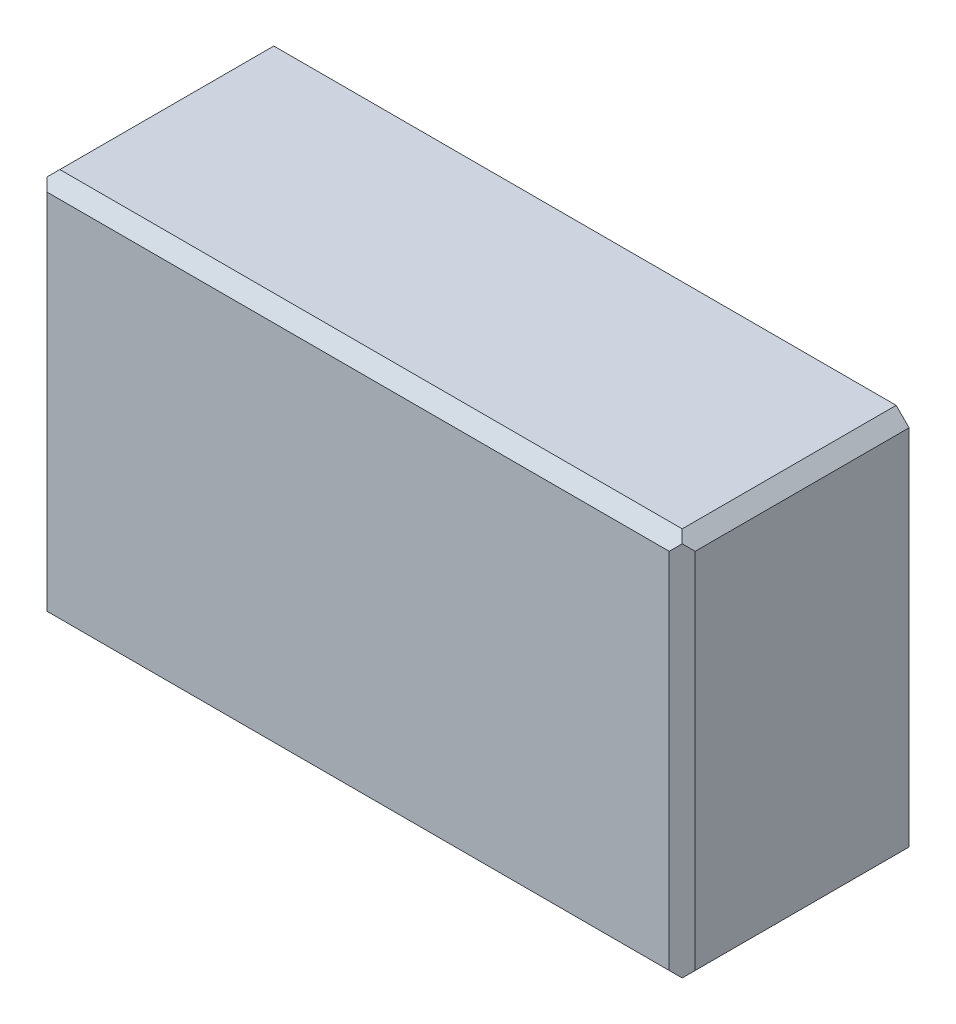
ISO-10303-21;
HEADER;
FILE_DESCRIPTION(('STEP AP214'),'2;1');
FILE_NAME('part.step','',(''),(''),'','','');
FILE_SCHEMA(('AUTOMOTIVE_DESIGN { 1 0 10303 214 1 1 1 1 }'));
ENDSEC;
DATA;
#1=APPLICATION_CONTEXT('core data for automotive mechanical design processes');
#2=APPLICATION_PROTOCOL_DEFINITION('international standard','automotive_design',2000,#1);
#3=PRODUCT_CONTEXT('',#1,'mechanical');
#4=PRODUCT('Part','Part','',(#3));
#5=PRODUCT_RELATED_PRODUCT_CATEGORY('part','',(#4));
#6=PRODUCT_DEFINITION_FORMATION('','',#4);
#7=PRODUCT_DEFINITION_CONTEXT('part definition',#1,'design');
#8=PRODUCT_DEFINITION('design','',#6,#7);
#9=PRODUCT_DEFINITION_SHAPE('','',#8);
#10=(LENGTH_UNIT() NAMED_UNIT(*) SI_UNIT(.MILLI.,.METRE.));
#11=(NAMED_UNIT(*) PLANE_ANGLE_UNIT() SI_UNIT($,.RADIAN.));
#12=(NAMED_UNIT(*) SI_UNIT($,.STERADIAN.) SOLID_ANGLE_UNIT());
#13=UNCERTAINTY_MEASURE_WITH_UNIT(LENGTH_MEASURE(1.E-05),#10,'distance_accuracy_value','');
#14=(GEOMETRIC_REPRESENTATION_CONTEXT(3) GLOBAL_UNCERTAINTY_ASSIGNED_CONTEXT((#13)) GLOBAL_UNIT_ASSIGNED_CONTEXT((#10,
#11,#12)) REPRESENTATION_CONTEXT('',''));
#15=CARTESIAN_POINT('',(0.,0.,0.));
#16=DIRECTION('',(0.,0.,1.));
#17=DIRECTION('',(1.,0.,0.));
#18=AXIS2_PLACEMENT_3D('',#15,#16,#17);
#19=CARTESIAN_POINT('',(0.,0.,0.0862000000000108));
#20=DIRECTION('',(0.,0.,-1.));
#21=DIRECTION('',(-1.,0.,0.));
#22=AXIS2_PLACEMENT_3D('',#19,#20,#21);
#23=PLANE('',#22);
#24=DIRECTION('',(1.,0.,0.));
#25=VECTOR('',#24,1.);
#26=CARTESIAN_POINT('',(-0.415997395786882,0.249999999999991,0.0862000000000108));
#27=LINE('',#26,#25);
#28=CARTESIAN_POINT('',(-0.215997395786768,0.249999999999991,0.0862000000000108));
#29=VERTEX_POINT('',#28);
#30=CARTESIAN_POINT('',(-0.41599739578678,0.249999999999991,0.0862000000000108));
#31=VERTEX_POINT('',#30);
#32=EDGE_CURVE('E184',#29,#31,#27,.F.);
#33=ORIENTED_EDGE('',*,*,#32,.F.);
#34=DIRECTION('',(0.,1.,0.));
#35=VECTOR('',#34,1.);
#36=CARTESIAN_POINT('',(-0.215997395786768,0.249999999999991,0.0862000000000108));
#37=LINE('',#36,#35);
#38=CARTESIAN_POINT('',(-0.215997395786768,-0.249999999999991,0.0862000000000108));
#39=VERTEX_POINT('',#38);
#40=EDGE_CURVE('E212',#39,#29,#37,.T.);
#41=ORIENTED_EDGE('',*,*,#40,.F.);
#42=DIRECTION('',(1.,0.,0.));
#43=VECTOR('',#42,1.);
#44=CARTESIAN_POINT('',(-0.215997395786768,-0.249999999999991,0.0862000000000108));
#45=LINE('',#44,#43);
#46=CARTESIAN_POINT('',(-0.465997395786682,-0.249999999999991,0.0862000000000108));
#47=VERTEX_POINT('',#46);
#48=EDGE_CURVE('E163',#47,#39,#45,.T.);
#49=ORIENTED_EDGE('',*,*,#48,.F.);
#50=DIRECTION('',(0.,1.,0.));
#51=VECTOR('',#50,1.);
#52=CARTESIAN_POINT('',(-0.465997395786682,-0.249999999999991,0.0862000000000108));
#53=LINE('',#52,#51);
#54=CARTESIAN_POINT('',(-0.465997395786682,0.199999999999987,0.0862000000000108));
#55=VERTEX_POINT('',#54);
#56=EDGE_CURVE('E157',#55,#47,#53,.F.);
#57=ORIENTED_EDGE('',*,*,#56,.F.);
#58=CARTESIAN_POINT('',(-0.465997395786682,0.249999999999991,0.0862000000000108));
#59=DIRECTION('',(0.,0.,-1.));
#60=DIRECTION('',(-1.,0.,0.));
#61=AXIS2_PLACEMENT_3D('',#58,#59,#60);
#62=CIRCLE('',#61,0.0500000000000032);
#63=EDGE_CURVE('E20',#55,#31,#62,.F.);
#64=ORIENTED_EDGE('',*,*,#63,.T.);
#65=EDGE_LOOP('',(#33,#41,#49,#57,#64));
#66=FACE_BOUND('',#65,.T.);
#67=ADVANCED_FACE('F17',(#66),#23,.T.);
#68=CARTESIAN_POINT('',(0.,0.,0.0862000000000108));
#69=DIRECTION('',(0.,0.,-1.));
#70=DIRECTION('',(-1.,0.,0.));
#71=AXIS2_PLACEMENT_3D('',#68,#69,#70);
#72=PLANE('',#71);
#73=DIRECTION('',(1.,0.,0.));
#74=VECTOR('',#73,1.);
#75=CARTESIAN_POINT('',(0.184002604213233,0.249999999999991,0.0862000000000108));
#76=LINE('',#75,#74);
#77=CARTESIAN_POINT('',(0.434002604213274,0.249999999999991,0.0862000000000108));
#78=VERTEX_POINT('',#77);
#79=CARTESIAN_POINT('',(0.184002604213233,0.249999999999991,0.0862000000000108));
#80=VERTEX_POINT('',#79);
#81=EDGE_CURVE('E253',#78,#80,#76,.F.);
#82=ORIENTED_EDGE('',*,*,#81,.F.);
#83=DIRECTION('',(0.,1.,0.));
#84=VECTOR('',#83,1.);
#85=CARTESIAN_POINT('',(0.434002604213274,0.249999999999991,0.0862000000000108));
#86=LINE('',#85,#84);
#87=CARTESIAN_POINT('',(0.434002604213274,-0.249999999999991,0.0862000000000108));
#88=VERTEX_POINT('',#87);
#89=EDGE_CURVE('E270',#88,#78,#86,.T.);
#90=ORIENTED_EDGE('',*,*,#89,.F.);
#91=DIRECTION('',(1.,0.,0.));
#92=VECTOR('',#91,1.);
#93=CARTESIAN_POINT('',(0.434002604213274,-0.249999999999991,0.0862000000000108));
#94=LINE('',#93,#92);
#95=CARTESIAN_POINT('',(0.184002604213233,-0.249999999999991,0.0862000000000108));
#96=VERTEX_POINT('',#95);
#97=EDGE_CURVE('E268',#96,#88,#94,.T.);
#98=ORIENTED_EDGE('',*,*,#97,.F.);
#99=DIRECTION('',(0.,1.,0.));
#100=VECTOR('',#99,1.);
#101=CARTESIAN_POINT('',(0.184002604213233,-0.249999999999991,0.0862000000000108));
#102=LINE('',#101,#100);
#103=EDGE_CURVE('E262',#80,#96,#102,.F.);
#104=ORIENTED_EDGE('',*,*,#103,.F.);
#105=EDGE_LOOP('',(#82,#90,#98,#104));
#106=FACE_BOUND('',#105,.T.);
#107=ADVANCED_FACE('F294',(#106),#72,.T.);
#108=CARTESIAN_POINT('',(-0.215997395786768,0.249999999999991,0.126200000000003));
#109=DIRECTION('',(1.,0.,0.));
#110=DIRECTION('',(0.,0.,-1.));
#111=AXIS2_PLACEMENT_3D('',#108,#109,#110);
#112=PLANE('',#111);
#113=DIRECTION('',(0.,0.,1.));
#114=VECTOR('',#113,1.);
#115=CARTESIAN_POINT('',(-0.215997395786768,0.249999999999991,0.126200000000003));
#116=LINE('',#115,#114);
#117=CARTESIAN_POINT('',(-0.215997395786768,0.249999999999991,0.126200000000003));
#118=VERTEX_POINT('',#117);
#119=EDGE_CURVE('E182',#118,#29,#116,.F.);
#120=ORIENTED_EDGE('',*,*,#119,.F.);
#121=DIRECTION('',(0.,1.,0.));
#122=VECTOR('',#121,1.);
#123=CARTESIAN_POINT('',(-0.215997395786768,0.,0.126200000000003));
#124=LINE('',#123,#122);
#125=CARTESIAN_POINT('',(-0.215997395786768,-0.249999999999991,0.126200000000003));
#126=VERTEX_POINT('',#125);
#127=EDGE_CURVE('E194',#118,#126,#124,.F.);
#128=ORIENTED_EDGE('',*,*,#127,.T.);
#129=DIRECTION('',(0.,0.,-1.));
#130=VECTOR('',#129,1.);
#131=CARTESIAN_POINT('',(-0.215997395786768,-0.249999999999991,0.126200000000003));
#132=LINE('',#131,#130);
#133=EDGE_CURVE('E168',#39,#126,#132,.F.);
#134=ORIENTED_EDGE('',*,*,#133,.F.);
#135=ORIENTED_EDGE('',*,*,#40,.T.);
#136=EDGE_LOOP('',(#120,#128,#134,#135));
#137=FACE_BOUND('',#136,.T.);
#138=ADVANCED_FACE('F283',(#137),#112,.T.);
#139=CARTESIAN_POINT('',(-0.215997395786768,-0.249999999999991,0.126200000000003));
#140=DIRECTION('',(0.,-1.,0.));
#141=DIRECTION('',(0.,0.,-1.));
#142=AXIS2_PLACEMENT_3D('',#139,#140,#141);
#143=PLANE('',#142);
#144=ORIENTED_EDGE('',*,*,#133,.T.);
#145=DIRECTION('',(1.,0.,0.));
#146=VECTOR('',#145,1.);
#147=CARTESIAN_POINT('',(0.,-0.249999999999991,0.126200000000003));
#148=LINE('',#147,#146);
#149=CARTESIAN_POINT('',(-0.465997395786682,-0.249999999999991,0.126200000000003));
#150=VERTEX_POINT('',#149);
#151=EDGE_CURVE('E196',#126,#150,#148,.F.);
#152=ORIENTED_EDGE('',*,*,#151,.T.);
#153=DIRECTION('',(0.,0.,1.));
#154=VECTOR('',#153,1.);
#155=CARTESIAN_POINT('',(-0.465997395786682,-0.249999999999991,0.126200000000003));
#156=LINE('',#155,#154);
#157=EDGE_CURVE('E167',#47,#150,#156,.T.);
#158=ORIENTED_EDGE('',*,*,#157,.F.);
#159=ORIENTED_EDGE('',*,*,#48,.T.);
#160=EDGE_LOOP('',(#144,#152,#158,#159));
#161=FACE_BOUND('',#160,.T.);
#162=ADVANCED_FACE('F285',(#161),#143,.T.);
#163=CARTESIAN_POINT('',(-0.465997395786682,-0.249999999999991,0.126200000000003));
#164=DIRECTION('',(-1.,0.,0.));
#165=DIRECTION('',(0.,0.,1.));
#166=AXIS2_PLACEMENT_3D('',#163,#164,#165);
#167=PLANE('',#166);
#168=ORIENTED_EDGE('',*,*,#157,.T.);
#169=DIRECTION('',(0.,1.,0.));
#170=VECTOR('',#169,1.);
#171=CARTESIAN_POINT('',(-0.465997395786682,0.,0.126200000000003));
#172=LINE('',#171,#170);
#173=CARTESIAN_POINT('',(-0.465997395786682,0.199999999999987,0.126200000000003));
#174=VERTEX_POINT('',#173);
#175=EDGE_CURVE('E174',#150,#174,#172,.T.);
#176=ORIENTED_EDGE('',*,*,#175,.T.);
#177=DIRECTION('',(0.,0.,-1.));
#178=VECTOR('',#177,1.);
#179=CARTESIAN_POINT('',(-0.465997395786682,0.199999999999987,0.126200000000003));
#180=LINE('',#179,#178);
#181=EDGE_CURVE('E171',#174,#55,#180,.T.);
#182=ORIENTED_EDGE('',*,*,#181,.T.);
#183=ORIENTED_EDGE('',*,*,#56,.T.);
#184=EDGE_LOOP('',(#168,#176,#182,#183));
#185=FACE_BOUND('',#184,.T.);
#186=ADVANCED_FACE('F172',(#185),#167,.T.);
#187=CARTESIAN_POINT('',(-0.465997395786682,0.249999999999991,0.126200000000003));
#188=DIRECTION('',(0.,0.,-1.));
#189=DIRECTION('',(-1.,0.,0.));
#190=AXIS2_PLACEMENT_3D('',#187,#188,#189);
#191=CYLINDRICAL_SURFACE('',#190,0.0500000000000032);
#192=ORIENTED_EDGE('',*,*,#63,.F.);
#193=ORIENTED_EDGE('',*,*,#181,.F.);
#194=CARTESIAN_POINT('',(-0.465997395786682,0.249999999999991,0.126200000000003));
#195=DIRECTION('',(0.,0.,-1.));
#196=DIRECTION('',(-1.,0.,0.));
#197=AXIS2_PLACEMENT_3D('',#194,#195,#196);
#198=CIRCLE('',#197,0.0500000000000032);
#199=CARTESIAN_POINT('',(-0.41599739578678,0.249999999999991,0.126200000000003));
#200=VERTEX_POINT('',#199);
#201=EDGE_CURVE('E220',#174,#200,#198,.F.);
#202=ORIENTED_EDGE('',*,*,#201,.T.);
#203=DIRECTION('',(0.,0.,1.));
#204=VECTOR('',#203,1.);
#205=CARTESIAN_POINT('',(-0.415997395786882,0.249999999999991,0.126200000000003));
#206=LINE('',#205,#204);
#207=EDGE_CURVE('E180',#31,#200,#206,.T.);
#208=ORIENTED_EDGE('',*,*,#207,.F.);
#209=EDGE_LOOP('',(#192,#193,#202,#208));
#210=FACE_BOUND('',#209,.T.);
#211=ADVANCED_FACE('F178',(#210),#191,.F.);
#212=CARTESIAN_POINT('',(-0.415997395786882,0.249999999999991,0.126200000000003));
#213=DIRECTION('',(0.,1.,0.));
#214=DIRECTION('',(0.,0.,1.));
#215=AXIS2_PLACEMENT_3D('',#212,#213,#214);
#216=PLANE('',#215);
#217=ORIENTED_EDGE('',*,*,#207,.T.);
#218=DIRECTION('',(1.,0.,0.));
#219=VECTOR('',#218,1.);
#220=CARTESIAN_POINT('',(0.,0.249999999999991,0.126200000000003));
#221=LINE('',#220,#219);
#222=EDGE_CURVE('E221',#200,#118,#221,.T.);
#223=ORIENTED_EDGE('',*,*,#222,.T.);
#224=ORIENTED_EDGE('',*,*,#119,.T.);
#225=ORIENTED_EDGE('',*,*,#32,.T.);
#226=EDGE_LOOP('',(#217,#223,#224,#225));
#227=FACE_BOUND('',#226,.T.);
#228=ADVANCED_FACE('F275',(#227),#216,.T.);
#229=CARTESIAN_POINT('',(0.434002604213274,0.249999999999991,0.126200000000003));
#230=DIRECTION('',(1.,0.,0.));
#231=DIRECTION('',(0.,0.,-1.));
#232=AXIS2_PLACEMENT_3D('',#229,#230,#231);
#233=PLANE('',#232);
#234=DIRECTION('',(0.,0.,1.));
#235=VECTOR('',#234,1.);
#236=CARTESIAN_POINT('',(0.434002604213274,0.249999999999991,0.126200000000003));
#237=LINE('',#236,#235);
#238=CARTESIAN_POINT('',(0.434002604213274,0.249999999999991,0.126200000000003));
#239=VERTEX_POINT('',#238);
#240=EDGE_CURVE('E256',#239,#78,#237,.F.);
#241=ORIENTED_EDGE('',*,*,#240,.F.);
#242=DIRECTION('',(0.,1.,0.));
#243=VECTOR('',#242,1.);
#244=CARTESIAN_POINT('',(0.434002604213274,0.,0.126200000000003));
#245=LINE('',#244,#243);
#246=CARTESIAN_POINT('',(0.434002604213274,-0.249999999999991,0.126200000000003));
#247=VERTEX_POINT('',#246);
#248=EDGE_CURVE('E222',#239,#247,#245,.F.);
#249=ORIENTED_EDGE('',*,*,#248,.T.);
#250=DIRECTION('',(0.,0.,-1.));
#251=VECTOR('',#250,1.);
#252=CARTESIAN_POINT('',(0.434002604213274,-0.249999999999991,0.126200000000003));
#253=LINE('',#252,#251);
#254=EDGE_CURVE('E265',#88,#247,#253,.F.);
#255=ORIENTED_EDGE('',*,*,#254,.F.);
#256=ORIENTED_EDGE('',*,*,#89,.T.);
#257=EDGE_LOOP('',(#241,#249,#255,#256));
#258=FACE_BOUND('',#257,.T.);
#259=ADVANCED_FACE('F365',(#258),#233,.T.);
#260=CARTESIAN_POINT('',(0.434002604213274,-0.249999999999991,0.126200000000003));
#261=DIRECTION('',(0.,-1.,0.));
#262=DIRECTION('',(0.,0.,-1.));
#263=AXIS2_PLACEMENT_3D('',#260,#261,#262);
#264=PLANE('',#263);
#265=ORIENTED_EDGE('',*,*,#254,.T.);
#266=DIRECTION('',(1.,0.,0.));
#267=VECTOR('',#266,1.);
#268=CARTESIAN_POINT('',(0.,-0.249999999999991,0.126200000000003));
#269=LINE('',#268,#267);
#270=CARTESIAN_POINT('',(0.184002604213233,-0.249999999999991,0.126200000000003));
#271=VERTEX_POINT('',#270);
#272=EDGE_CURVE('E534',#247,#271,#269,.F.);
#273=ORIENTED_EDGE('',*,*,#272,.T.);
#274=DIRECTION('',(0.,0.,1.));
#275=VECTOR('',#274,1.);
#276=CARTESIAN_POINT('',(0.184002604213233,-0.249999999999991,0.126200000000003));
#277=LINE('',#276,#275);
#278=EDGE_CURVE('E259',#96,#271,#277,.T.);
#279=ORIENTED_EDGE('',*,*,#278,.F.);
#280=ORIENTED_EDGE('',*,*,#97,.T.);
#281=EDGE_LOOP('',(#265,#273,#279,#280));
#282=FACE_BOUND('',#281,.T.);
#283=ADVANCED_FACE('F361',(#282),#264,.T.);
#284=CARTESIAN_POINT('',(0.184002604213233,-0.249999999999991,0.126200000000003));
#285=DIRECTION('',(-1.,0.,0.));
#286=DIRECTION('',(0.,0.,1.));
#287=AXIS2_PLACEMENT_3D('',#284,#285,#286);
#288=PLANE('',#287);
#289=ORIENTED_EDGE('',*,*,#278,.T.);
#290=DIRECTION('',(0.,1.,0.));
#291=VECTOR('',#290,1.);
#292=CARTESIAN_POINT('',(0.184002604213233,0.,0.126200000000003));
#293=LINE('',#292,#291);
#294=CARTESIAN_POINT('',(0.184002604213233,0.249999999999991,0.126200000000003));
#295=VERTEX_POINT('',#294);
#296=EDGE_CURVE('E538',#271,#295,#293,.T.);
#297=ORIENTED_EDGE('',*,*,#296,.T.);
#298=DIRECTION('',(0.,0.,1.));
#299=VECTOR('',#298,1.);
#300=CARTESIAN_POINT('',(0.184002604213233,0.249999999999991,0.126200000000003));
#301=LINE('',#300,#299);
#302=EDGE_CURVE('E250',#80,#295,#301,.T.);
#303=ORIENTED_EDGE('',*,*,#302,.F.);
#304=ORIENTED_EDGE('',*,*,#103,.T.);
#305=EDGE_LOOP('',(#289,#297,#303,#304));
#306=FACE_BOUND('',#305,.T.);
#307=ADVANCED_FACE('F357',(#306),#288,.T.);
#308=CARTESIAN_POINT('',(0.184002604213233,0.249999999999991,0.126200000000003));
#309=DIRECTION('',(0.,1.,0.));
#310=DIRECTION('',(0.,0.,1.));
#311=AXIS2_PLACEMENT_3D('',#308,#309,#310);
#312=PLANE('',#311);
#313=ORIENTED_EDGE('',*,*,#302,.T.);
#314=DIRECTION('',(1.,0.,0.));
#315=VECTOR('',#314,1.);
#316=CARTESIAN_POINT('',(0.,0.249999999999991,0.126200000000003));
#317=LINE('',#316,#315);
#318=EDGE_CURVE('E531',#295,#239,#317,.T.);
#319=ORIENTED_EDGE('',*,*,#318,.T.);
#320=ORIENTED_EDGE('',*,*,#240,.T.);
#321=ORIENTED_EDGE('',*,*,#81,.T.);
#322=EDGE_LOOP('',(#313,#319,#320,#321));
#323=FACE_BOUND('',#322,.T.);
#324=ADVANCED_FACE('F353',(#323),#312,.T.);
#325=CARTESIAN_POINT('',(-0.490000000000072,0.29000000000011,0.3012249999999));
#326=DIRECTION('',(-0.707106781186548,0.707106781186548,0.));
#327=DIRECTION('',(-0.707106781186548,-0.707106781186548,0.));
#328=AXIS2_PLACEMENT_3D('',#325,#326,#327);
#329=PLANE('',#328);
#330=DIRECTION('',(0.,0.,1.));
#331=VECTOR('',#330,1.);
#332=CARTESIAN_POINT('',(-0.480000000000112,0.30000000000007,0.0762));
#333=LINE('',#332,#331);
#334=CARTESIAN_POINT('',(-0.480000000000112,0.30000000000007,0.126200000000003));
#335=VERTEX_POINT('',#334);
#336=CARTESIAN_POINT('',(-0.480000000000112,0.30000000000007,0.45625000000008));
#337=VERTEX_POINT('',#336);
#338=EDGE_CURVE('E554',#335,#337,#333,.T.);
#339=ORIENTED_EDGE('',*,*,#338,.F.);
#340=DIRECTION('',(-0.707106781182058,-0.707106781191037,0.));
#341=VECTOR('',#340,1.);
#342=CARTESIAN_POINT('',(-0.480000000000112,0.30000000000007,0.126200000000003));
#343=LINE('',#342,#341);
#344=CARTESIAN_POINT('',(-0.500000000000095,0.27999999999996,0.126200000000003));
#345=VERTEX_POINT('',#344);
#346=EDGE_CURVE('E233',#335,#345,#343,.T.);
#347=ORIENTED_EDGE('',*,*,#346,.T.);
#348=DIRECTION('',(0.,0.,1.));
#349=VECTOR('',#348,1.);
#350=CARTESIAN_POINT('',(-0.500000000000032,0.279999999999896,0.0762));
#351=LINE('',#350,#349);
#352=CARTESIAN_POINT('',(-0.500000000000095,0.27999999999996,0.45625000000008));
#353=VERTEX_POINT('',#352);
#354=EDGE_CURVE('E560',#353,#345,#351,.F.);
#355=ORIENTED_EDGE('',*,*,#354,.F.);
#356=DIRECTION('',(0.577350269192069,0.577350269192069,0.577350269184739));
#357=VECTOR('',#356,1.);
#358=CARTESIAN_POINT('',(-0.500000000000159,0.280000000000023,0.45625000000008));
#359=LINE('',#358,#357);
#360=CARTESIAN_POINT('',(-0.490000000000072,0.29000000000011,0.46625000000004));
#361=VERTEX_POINT('',#360);
#362=EDGE_CURVE('E247',#353,#361,#359,.T.);
#363=ORIENTED_EDGE('',*,*,#362,.T.);
#364=DIRECTION('',(0.577350269189626,0.577350269189626,-0.577350269189626));
#365=VECTOR('',#364,1.);
#366=CARTESIAN_POINT('',(-0.490000000000072,0.29000000000011,0.46625000000004));
#367=LINE('',#366,#365);
#368=EDGE_CURVE('E245',#361,#337,#367,.T.);
#369=ORIENTED_EDGE('',*,*,#368,.T.);
#370=EDGE_LOOP('',(#339,#347,#355,#363,#369));
#371=FACE_BOUND('',#370,.T.);
#372=ADVANCED_FACE('F349',(#371),#329,.T.);
#373=CARTESIAN_POINT('',(-0.490000000000072,-0.29000000000011,0.3012249999999));
#374=DIRECTION('',(-0.707106781186548,-0.707106781186548,0.));
#375=DIRECTION('',(0.707106781186548,-0.707106781186548,0.));
#376=AXIS2_PLACEMENT_3D('',#373,#374,#375);
#377=PLANE('',#376);
#378=DIRECTION('',(0.,0.,1.));
#379=VECTOR('',#378,1.);
#380=CARTESIAN_POINT('',(-0.500000000000032,-0.279999999999896,0.0762));
#381=LINE('',#380,#379);
#382=CARTESIAN_POINT('',(-0.500000000000064,-0.279999999999928,0.126200000000003));
#383=VERTEX_POINT('',#382);
#384=CARTESIAN_POINT('',(-0.500000000000095,-0.27999999999996,0.45625000000008));
#385=VERTEX_POINT('',#384);
#386=EDGE_CURVE('E566',#383,#385,#381,.T.);
#387=ORIENTED_EDGE('',*,*,#386,.F.);
#388=DIRECTION('',(0.707106781182058,-0.707106781191037,0.));
#389=VECTOR('',#388,1.);
#390=CARTESIAN_POINT('',(-0.500000000000032,-0.279999999999896,0.126200000000003));
#391=LINE('',#390,#389);
#392=CARTESIAN_POINT('',(-0.480000000000112,-0.30000000000007,0.126200000000003));
#393=VERTEX_POINT('',#392);
#394=EDGE_CURVE('E231',#383,#393,#391,.T.);
#395=ORIENTED_EDGE('',*,*,#394,.T.);
#396=DIRECTION('',(0.,0.,-1.));
#397=VECTOR('',#396,1.);
#398=CARTESIAN_POINT('',(-0.480000000000112,-0.30000000000007,0.0762));
#399=LINE('',#398,#397);
#400=CARTESIAN_POINT('',(-0.480000000000112,-0.30000000000007,0.45625000000008));
#401=VERTEX_POINT('',#400);
#402=EDGE_CURVE('E569',#401,#393,#399,.T.);
#403=ORIENTED_EDGE('',*,*,#402,.F.);
#404=DIRECTION('',(-0.577350269189626,0.577350269189626,0.577350269189626));
#405=VECTOR('',#404,1.);
#406=CARTESIAN_POINT('',(-0.480000000000112,-0.30000000000007,0.45625000000008));
#407=LINE('',#406,#405);
#408=CARTESIAN_POINT('',(-0.490000000000072,-0.29000000000011,0.46625000000004));
#409=VERTEX_POINT('',#408);
#410=EDGE_CURVE('E242',#401,#409,#407,.T.);
#411=ORIENTED_EDGE('',*,*,#410,.T.);
#412=DIRECTION('',(-0.577350269192069,0.577350269192069,-0.577350269184739));
#413=VECTOR('',#412,1.);
#414=CARTESIAN_POINT('',(-0.490000000000072,-0.29000000000011,0.46625000000004));
#415=LINE('',#414,#413);
#416=EDGE_CURVE('E240',#409,#385,#415,.T.);
#417=ORIENTED_EDGE('',*,*,#416,.T.);
#418=EDGE_LOOP('',(#387,#395,#403,#411,#417));
#419=FACE_BOUND('',#418,.T.);
#420=ADVANCED_FACE('F345',(#419),#377,.T.);
#421=CARTESIAN_POINT('',(0.490000000000072,-0.29000000000011,0.3012249999999));
#422=DIRECTION('',(0.707106781186548,-0.707106781186548,0.));
#423=DIRECTION('',(0.707106781186548,0.707106781186548,0.));
#424=AXIS2_PLACEMENT_3D('',#421,#422,#423);
#425=PLANE('',#424);
#426=DIRECTION('',(0.,0.,-1.));
#427=VECTOR('',#426,1.);
#428=CARTESIAN_POINT('',(0.480000000000112,-0.30000000000007,0.0762));
#429=LINE('',#428,#427);
#430=CARTESIAN_POINT('',(0.480000000000112,-0.30000000000007,0.126200000000003));
#431=VERTEX_POINT('',#430);
#432=CARTESIAN_POINT('',(0.480000000000112,-0.30000000000007,0.45625000000008));
#433=VERTEX_POINT('',#432);
#434=EDGE_CURVE('E575',#431,#433,#429,.F.);
#435=ORIENTED_EDGE('',*,*,#434,.F.);
#436=DIRECTION('',(0.707106781182058,0.707106781191037,0.));
#437=VECTOR('',#436,1.);
#438=CARTESIAN_POINT('',(0.480000000000112,-0.30000000000007,0.126200000000003));
#439=LINE('',#438,#437);
#440=CARTESIAN_POINT('',(0.500000000000095,-0.27999999999996,0.126200000000003));
#441=VERTEX_POINT('',#440);
#442=EDGE_CURVE('E197',#431,#441,#439,.T.);
#443=ORIENTED_EDGE('',*,*,#442,.T.);
#444=DIRECTION('',(0.,0.,-1.));
#445=VECTOR('',#444,1.);
#446=CARTESIAN_POINT('',(0.500000000000032,-0.279999999999896,0.0762));
#447=LINE('',#446,#445);
#448=CARTESIAN_POINT('',(0.500000000000095,-0.27999999999996,0.45625000000008));
#449=VERTEX_POINT('',#448);
#450=EDGE_CURVE('E578',#449,#441,#447,.T.);
#451=ORIENTED_EDGE('',*,*,#450,.F.);
#452=DIRECTION('',(-0.577350269192069,-0.577350269192069,0.577350269184739));
#453=VECTOR('',#452,1.);
#454=CARTESIAN_POINT('',(0.500000000000159,-0.280000000000023,0.45625000000008));
#455=LINE('',#454,#453);
#456=CARTESIAN_POINT('',(0.490000000000072,-0.29000000000011,0.46625000000004));
#457=VERTEX_POINT('',#456);
#458=EDGE_CURVE('E237',#449,#457,#455,.T.);
#459=ORIENTED_EDGE('',*,*,#458,.T.);
#460=DIRECTION('',(-0.577350269189626,-0.577350269189626,-0.577350269189626));
#461=VECTOR('',#460,1.);
#462=CARTESIAN_POINT('',(0.490000000000072,-0.29000000000011,0.46625000000004));
#463=LINE('',#462,#461);
#464=EDGE_CURVE('E235',#457,#433,#463,.T.);
#465=ORIENTED_EDGE('',*,*,#464,.T.);
#466=EDGE_LOOP('',(#435,#443,#451,#459,#465));
#467=FACE_BOUND('',#466,.T.);
#468=ADVANCED_FACE('F341',(#467),#425,.T.);
#469=CARTESIAN_POINT('',(0.,0.,0.126200000000003));
#470=DIRECTION('',(0.,0.,1.));
#471=DIRECTION('',(1.,0.,0.));
#472=AXIS2_PLACEMENT_3D('',#469,#470,#471);
#473=PLANE('',#472);
#474=ORIENTED_EDGE('',*,*,#296,.F.);
#475=ORIENTED_EDGE('',*,*,#272,.F.);
#476=ORIENTED_EDGE('',*,*,#248,.F.);
#477=ORIENTED_EDGE('',*,*,#318,.F.);
#478=EDGE_LOOP('',(#474,#475,#476,#477));
#479=FACE_BOUND('',#478,.T.);
#480=ORIENTED_EDGE('',*,*,#201,.F.);
#481=ORIENTED_EDGE('',*,*,#175,.F.);
#482=ORIENTED_EDGE('',*,*,#151,.F.);
#483=ORIENTED_EDGE('',*,*,#127,.F.);
#484=ORIENTED_EDGE('',*,*,#222,.F.);
#485=EDGE_LOOP('',(#480,#481,#482,#483,#484));
#486=FACE_BOUND('',#485,.T.);
#487=ORIENTED_EDGE('',*,*,#442,.F.);
#488=DIRECTION('',(1.,0.,0.));
#489=VECTOR('',#488,1.);
#490=CARTESIAN_POINT('',(-0.500000000000032,-0.30000000000007,0.126200000000003));
#491=LINE('',#490,#489);
#492=EDGE_CURVE('E572',#393,#431,#491,.T.);
#493=ORIENTED_EDGE('',*,*,#492,.F.);
#494=ORIENTED_EDGE('',*,*,#394,.F.);
#495=DIRECTION('',(0.,1.,0.));
#496=VECTOR('',#495,1.);
#497=CARTESIAN_POINT('',(-0.500000000000032,0.30000000000007,0.126200000000003));
#498=LINE('',#497,#496);
#499=EDGE_CURVE('E563',#345,#383,#498,.F.);
#500=ORIENTED_EDGE('',*,*,#499,.F.);
#501=ORIENTED_EDGE('',*,*,#346,.F.);
#502=DIRECTION('',(1.,0.,0.));
#503=VECTOR('',#502,1.);
#504=CARTESIAN_POINT('',(0.500000000000032,0.30000000000007,0.126200000000003));
#505=LINE('',#504,#503);
#506=CARTESIAN_POINT('',(0.480000000000112,0.30000000000007,0.126200000000003));
#507=VERTEX_POINT('',#506);
#508=EDGE_CURVE('E551',#507,#335,#505,.F.);
#509=ORIENTED_EDGE('',*,*,#508,.F.);
#510=DIRECTION('',(-0.707106781186548,0.707106781186548,0.));
#511=VECTOR('',#510,1.);
#512=CARTESIAN_POINT('',(0.490000000000072,0.29000000000011,0.126200000000003));
#513=LINE('',#512,#511);
#514=CARTESIAN_POINT('',(0.500000000000064,0.279999999999928,0.126200000000003));
#515=VERTEX_POINT('',#514);
#516=EDGE_CURVE('E548',#515,#507,#513,.T.);
#517=ORIENTED_EDGE('',*,*,#516,.F.);
#518=DIRECTION('',(0.,1.,0.));
#519=VECTOR('',#518,1.);
#520=CARTESIAN_POINT('',(0.500000000000032,-0.30000000000007,0.126200000000003));
#521=LINE('',#520,#519);
#522=EDGE_CURVE('E581',#441,#515,#521,.T.);
#523=ORIENTED_EDGE('',*,*,#522,.F.);
#524=EDGE_LOOP('',(#487,#493,#494,#500,#501,#509,#517,#523));
#525=FACE_BOUND('',#524,.T.);
#526=ADVANCED_FACE('F278',(#479,#486,#525),#473,.F.);
#527=CARTESIAN_POINT('',(0.490000000000072,0.29000000000011,0.3012249999999));
#528=DIRECTION('',(0.707106781186548,0.707106781186548,0.));
#529=DIRECTION('',(-0.707106781186548,0.707106781186548,0.));
#530=AXIS2_PLACEMENT_3D('',#527,#528,#529);
#531=PLANE('',#530);
#532=DIRECTION('',(0.,0.,-1.));
#533=VECTOR('',#532,1.);
#534=CARTESIAN_POINT('',(0.500000000000032,0.279999999999896,0.0762));
#535=LINE('',#534,#533);
#536=CARTESIAN_POINT('',(0.500000000000095,0.27999999999996,0.45625000000008));
#537=VERTEX_POINT('',#536);
#538=EDGE_CURVE('E584',#515,#537,#535,.F.);
#539=ORIENTED_EDGE('',*,*,#538,.F.);
#540=ORIENTED_EDGE('',*,*,#516,.T.);
#541=DIRECTION('',(0.,0.,1.));
#542=VECTOR('',#541,1.);
#543=CARTESIAN_POINT('',(0.480000000000112,0.30000000000007,0.0762));
#544=LINE('',#543,#542);
#545=CARTESIAN_POINT('',(0.480000000000112,0.30000000000007,0.45625000000008));
#546=VERTEX_POINT('',#545);
#547=EDGE_CURVE('E557',#546,#507,#544,.F.);
#548=ORIENTED_EDGE('',*,*,#547,.F.);
#549=DIRECTION('',(0.577350269189626,-0.577350269189626,0.577350269189626));
#550=VECTOR('',#549,1.);
#551=CARTESIAN_POINT('',(0.480000000000112,0.30000000000007,0.45625000000008));
#552=LINE('',#551,#550);
#553=CARTESIAN_POINT('',(0.490000000000072,0.29000000000011,0.46625000000004));
#554=VERTEX_POINT('',#553);
#555=EDGE_CURVE('E543',#546,#554,#552,.T.);
#556=ORIENTED_EDGE('',*,*,#555,.T.);
#557=DIRECTION('',(0.577350269192069,-0.577350269192069,-0.577350269184739));
#558=VECTOR('',#557,1.);
#559=CARTESIAN_POINT('',(0.490000000000072,0.29000000000011,0.46625000000004));
#560=LINE('',#559,#558);
#561=EDGE_CURVE('E546',#554,#537,#560,.T.);
#562=ORIENTED_EDGE('',*,*,#561,.T.);
#563=EDGE_LOOP('',(#539,#540,#548,#556,#562));
#564=FACE_BOUND('',#563,.T.);
#565=ADVANCED_FACE('F334',(#564),#531,.T.);
#566=CARTESIAN_POINT('',(0.500000000000032,0.30000000000007,0.0762));
#567=DIRECTION('',(0.,1.,0.));
#568=DIRECTION('',(0.,0.,1.));
#569=AXIS2_PLACEMENT_3D('',#566,#567,#568);
#570=PLANE('',#569);
#571=DIRECTION('',(1.,0.,0.));
#572=VECTOR('',#571,1.);
#573=CARTESIAN_POINT('',(0.,0.30000000000007,0.45625000000008));
#574=LINE('',#573,#572);
#575=EDGE_CURVE('E587',#546,#337,#574,.F.);
#576=ORIENTED_EDGE('',*,*,#575,.F.);
#577=ORIENTED_EDGE('',*,*,#547,.T.);
#578=ORIENTED_EDGE('',*,*,#508,.T.);
#579=ORIENTED_EDGE('',*,*,#338,.T.);
#580=EDGE_LOOP('',(#576,#577,#578,#579));
#581=FACE_BOUND('',#580,.T.);
#582=ADVANCED_FACE('F330',(#581),#570,.T.);
#583=CARTESIAN_POINT('',(-0.500000000000032,0.30000000000007,0.0762));
#584=DIRECTION('',(-1.,0.,0.));
#585=DIRECTION('',(0.,0.,1.));
#586=AXIS2_PLACEMENT_3D('',#583,#584,#585);
#587=PLANE('',#586);
#588=ORIENTED_EDGE('',*,*,#499,.T.);
#589=ORIENTED_EDGE('',*,*,#386,.T.);
#590=DIRECTION('',(0.,1.,0.));
#591=VECTOR('',#590,1.);
#592=CARTESIAN_POINT('',(-0.500000000000032,0.,0.45625000000008));
#593=LINE('',#592,#591);
#594=EDGE_CURVE('E593',#353,#385,#593,.F.);
#595=ORIENTED_EDGE('',*,*,#594,.F.);
#596=ORIENTED_EDGE('',*,*,#354,.T.);
#597=EDGE_LOOP('',(#588,#589,#595,#596));
#598=FACE_BOUND('',#597,.T.);
#599=ADVANCED_FACE('F326',(#598),#587,.T.);
#600=CARTESIAN_POINT('',(-0.500000000000032,-0.30000000000007,0.0762));
#601=DIRECTION('',(0.,-1.,0.));
#602=DIRECTION('',(0.,0.,-1.));
#603=AXIS2_PLACEMENT_3D('',#600,#601,#602);
#604=PLANE('',#603);
#605=ORIENTED_EDGE('',*,*,#492,.T.);
#606=ORIENTED_EDGE('',*,*,#434,.T.);
#607=DIRECTION('',(1.,0.,0.));
#608=VECTOR('',#607,1.);
#609=CARTESIAN_POINT('',(0.,-0.30000000000007,0.45625000000008));
#610=LINE('',#609,#608);
#611=EDGE_CURVE('E599',#401,#433,#610,.T.);
#612=ORIENTED_EDGE('',*,*,#611,.F.);
#613=ORIENTED_EDGE('',*,*,#402,.T.);
#614=EDGE_LOOP('',(#605,#606,#612,#613));
#615=FACE_BOUND('',#614,.T.);
#616=ADVANCED_FACE('F322',(#615),#604,.T.);
#617=CARTESIAN_POINT('',(0.500000000000032,-0.30000000000007,0.0762));
#618=DIRECTION('',(1.,0.,0.));
#619=DIRECTION('',(0.,0.,-1.));
#620=AXIS2_PLACEMENT_3D('',#617,#618,#619);
#621=PLANE('',#620);
#622=ORIENTED_EDGE('',*,*,#522,.T.);
#623=ORIENTED_EDGE('',*,*,#538,.T.);
#624=DIRECTION('',(0.,1.,0.));
#625=VECTOR('',#624,1.);
#626=CARTESIAN_POINT('',(0.500000000000032,0.,0.45625000000008));
#627=LINE('',#626,#625);
#628=EDGE_CURVE('E606',#449,#537,#627,.T.);
#629=ORIENTED_EDGE('',*,*,#628,.F.);
#630=ORIENTED_EDGE('',*,*,#450,.T.);
#631=EDGE_LOOP('',(#622,#623,#629,#630));
#632=FACE_BOUND('',#631,.T.);
#633=ADVANCED_FACE('F318',(#632),#621,.T.);
#634=CARTESIAN_POINT('',(0.,0.29000000000011,0.46625000000004));
#635=DIRECTION('',(0.,0.707106781186548,0.707106781186548));
#636=DIRECTION('',(0.,-0.707106781186548,0.707106781186548));
#637=AXIS2_PLACEMENT_3D('',#634,#635,#636);
#638=PLANE('',#637);
#639=DIRECTION('',(-0.577350269184738,0.577350269199401,-0.577350269184738));
#640=VECTOR('',#639,1.);
#641=CARTESIAN_POINT('',(-0.480000000000112,0.279999999999896,0.47625));
#642=LINE('',#641,#640);
#643=CARTESIAN_POINT('',(-0.480000000000112,0.27999999999996,0.476250000000063));
#644=VERTEX_POINT('',#643);
#645=EDGE_CURVE('E590',#644,#361,#642,.T.);
#646=ORIENTED_EDGE('',*,*,#645,.F.);
#647=DIRECTION('',(1.,0.,0.));
#648=VECTOR('',#647,1.);
#649=CARTESIAN_POINT('',(0.,0.279999999999896,0.47625));
#650=LINE('',#649,#648);
#651=CARTESIAN_POINT('',(0.480000000000112,0.27999999999996,0.476250000000063));
#652=VERTEX_POINT('',#651);
#653=EDGE_CURVE('E609',#652,#644,#650,.F.);
#654=ORIENTED_EDGE('',*,*,#653,.F.);
#655=DIRECTION('',(-0.577350269184738,-0.577350269199401,0.577350269184738));
#656=VECTOR('',#655,1.);
#657=CARTESIAN_POINT('',(0.490000000000072,0.29000000000011,0.46625000000004));
#658=LINE('',#657,#656);
#659=EDGE_CURVE('E602',#554,#652,#658,.T.);
#660=ORIENTED_EDGE('',*,*,#659,.F.);
#661=ORIENTED_EDGE('',*,*,#555,.F.);
#662=ORIENTED_EDGE('',*,*,#575,.T.);
#663=ORIENTED_EDGE('',*,*,#368,.F.);
#664=EDGE_LOOP('',(#646,#654,#660,#661,#662,#663));
#665=FACE_BOUND('',#664,.T.);
#666=ADVANCED_FACE('F314',(#665),#638,.T.);
#667=CARTESIAN_POINT('',(-0.490000000000072,0.,0.46625000000004));
#668=DIRECTION('',(-0.707106781186548,0.,0.707106781186548));
#669=DIRECTION('',(0.707106781186548,0.,0.707106781186548));
#670=AXIS2_PLACEMENT_3D('',#667,#668,#669);
#671=PLANE('',#670);
#672=ORIENTED_EDGE('',*,*,#362,.F.);
#673=ORIENTED_EDGE('',*,*,#594,.T.);
#674=ORIENTED_EDGE('',*,*,#416,.F.);
#675=DIRECTION('',(-0.577350269184739,-0.577350269192069,-0.577350269192069));
#676=VECTOR('',#675,1.);
#677=CARTESIAN_POINT('',(-0.480000000000112,-0.280000000000023,0.476250000000127));
#678=LINE('',#677,#676);
#679=CARTESIAN_POINT('',(-0.480000000000112,-0.279999999999928,0.476250000000032));
#680=VERTEX_POINT('',#679);
#681=EDGE_CURVE('E596',#680,#409,#678,.T.);
#682=ORIENTED_EDGE('',*,*,#681,.F.);
#683=DIRECTION('',(0.,1.,0.));
#684=VECTOR('',#683,1.);
#685=CARTESIAN_POINT('',(-0.480000000000112,0.,0.47625));
#686=LINE('',#685,#684);
#687=EDGE_CURVE('E612',#644,#680,#686,.F.);
#688=ORIENTED_EDGE('',*,*,#687,.F.);
#689=ORIENTED_EDGE('',*,*,#645,.T.);
#690=EDGE_LOOP('',(#672,#673,#674,#682,#688,#689));
#691=FACE_BOUND('',#690,.T.);
#692=ADVANCED_FACE('F311',(#691),#671,.T.);
#693=CARTESIAN_POINT('',(0.,-0.29000000000011,0.46625000000004));
#694=DIRECTION('',(0.,-0.707106781186548,0.707106781186548));
#695=DIRECTION('',(0.,-0.707106781186548,-0.707106781186548));
#696=AXIS2_PLACEMENT_3D('',#693,#694,#695);
#697=PLANE('',#696);
#698=ORIENTED_EDGE('',*,*,#410,.F.);
#699=ORIENTED_EDGE('',*,*,#611,.T.);
#700=ORIENTED_EDGE('',*,*,#464,.F.);
#701=DIRECTION('',(0.577350269184738,-0.577350269199401,-0.577350269184738));
#702=VECTOR('',#701,1.);
#703=CARTESIAN_POINT('',(0.480000000000112,-0.279999999999896,0.47625));
#704=LINE('',#703,#702);
#705=CARTESIAN_POINT('',(0.480000000000112,-0.27999999999996,0.476250000000063));
#706=VERTEX_POINT('',#705);
#707=EDGE_CURVE('E35',#706,#457,#704,.T.);
#708=ORIENTED_EDGE('',*,*,#707,.F.);
#709=DIRECTION('',(1.,0.,0.));
#710=VECTOR('',#709,1.);
#711=CARTESIAN_POINT('',(0.,-0.279999999999896,0.47625));
#712=LINE('',#711,#710);
#713=EDGE_CURVE('E26',#680,#706,#712,.T.);
#714=ORIENTED_EDGE('',*,*,#713,.F.);
#715=ORIENTED_EDGE('',*,*,#681,.T.);
#716=EDGE_LOOP('',(#698,#699,#700,#708,#714,#715));
#717=FACE_BOUND('',#716,.T.);
#718=ADVANCED_FACE('F304',(#717),#697,.T.);
#719=CARTESIAN_POINT('',(0.490000000000072,0.,0.46625000000004));
#720=DIRECTION('',(0.707106781186548,0.,0.707106781186548));
#721=DIRECTION('',(0.707106781186548,0.,-0.707106781186548));
#722=AXIS2_PLACEMENT_3D('',#719,#720,#721);
#723=PLANE('',#722);
#724=ORIENTED_EDGE('',*,*,#458,.F.);
#725=ORIENTED_EDGE('',*,*,#628,.T.);
#726=ORIENTED_EDGE('',*,*,#561,.F.);
#727=ORIENTED_EDGE('',*,*,#659,.T.);
#728=DIRECTION('',(0.,1.,0.));
#729=VECTOR('',#728,1.);
#730=CARTESIAN_POINT('',(0.480000000000112,0.,0.47625));
#731=LINE('',#730,#729);
#732=EDGE_CURVE('E11',#706,#652,#731,.T.);
#733=ORIENTED_EDGE('',*,*,#732,.F.);
#734=ORIENTED_EDGE('',*,*,#707,.T.);
#735=EDGE_LOOP('',(#724,#725,#726,#727,#733,#734));
#736=FACE_BOUND('',#735,.T.);
#737=ADVANCED_FACE('F298',(#736),#723,.T.);
#738=CARTESIAN_POINT('',(0.,0.,0.47625));
#739=DIRECTION('',(0.,0.,1.));
#740=DIRECTION('',(1.,0.,0.));
#741=AXIS2_PLACEMENT_3D('',#738,#739,#740);
#742=PLANE('',#741);
#743=ORIENTED_EDGE('',*,*,#713,.T.);
#744=ORIENTED_EDGE('',*,*,#732,.T.);
#745=ORIENTED_EDGE('',*,*,#653,.T.);
#746=ORIENTED_EDGE('',*,*,#687,.T.);
#747=EDGE_LOOP('',(#743,#744,#745,#746));
#748=FACE_BOUND('',#747,.T.);
#749=ADVANCED_FACE('F296',(#748),#742,.T.);
#750=CLOSED_SHELL('',(#67,#107,#138,#162,#186,#211,#228,#259,#283,#307,#324,#372,#420,#468,#526,
#565,#582,#599,#616,#633,#666,#692,#718,#737,#749));
#751=MANIFOLD_SOLID_BREP('B1',#750);
#752=ADVANCED_BREP_SHAPE_REPRESENTATION('',(#18,#751),#14);
#753=SHAPE_DEFINITION_REPRESENTATION(#9,#752);
ENDSEC;
END-ISO-10303-21;
